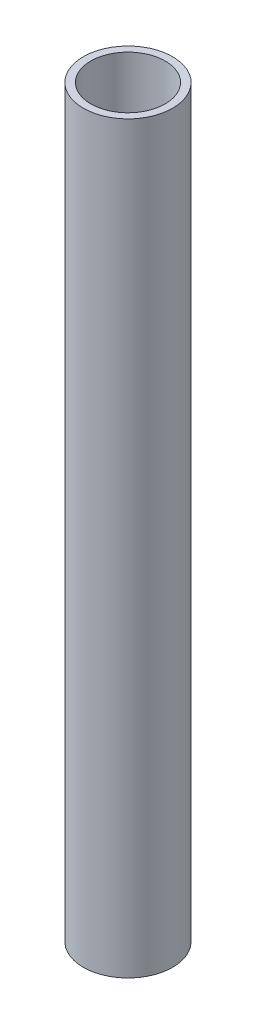
ISO-10303-21;
HEADER;
FILE_DESCRIPTION(('STEP AP214'),'2;1');
FILE_NAME('part.step','',(''),(''),'','','');
FILE_SCHEMA(('AUTOMOTIVE_DESIGN { 1 0 10303 214 1 1 1 1 }'));
ENDSEC;
DATA;
#1=APPLICATION_CONTEXT('core data for automotive mechanical design processes');
#2=APPLICATION_PROTOCOL_DEFINITION('international standard','automotive_design',2000,#1);
#3=PRODUCT_CONTEXT('',#1,'mechanical');
#4=PRODUCT('Part','Part','',(#3));
#5=PRODUCT_RELATED_PRODUCT_CATEGORY('part','',(#4));
#6=PRODUCT_DEFINITION_FORMATION('','',#4);
#7=PRODUCT_DEFINITION_CONTEXT('part definition',#1,'design');
#8=PRODUCT_DEFINITION('design','',#6,#7);
#9=PRODUCT_DEFINITION_SHAPE('','',#8);
#10=(LENGTH_UNIT() NAMED_UNIT(*) SI_UNIT(.MILLI.,.METRE.));
#11=(NAMED_UNIT(*) PLANE_ANGLE_UNIT() SI_UNIT($,.RADIAN.));
#12=(NAMED_UNIT(*) SI_UNIT($,.STERADIAN.) SOLID_ANGLE_UNIT());
#13=UNCERTAINTY_MEASURE_WITH_UNIT(LENGTH_MEASURE(1.E-05),#10,'distance_accuracy_value','');
#14=(GEOMETRIC_REPRESENTATION_CONTEXT(3) GLOBAL_UNCERTAINTY_ASSIGNED_CONTEXT((#13)) GLOBAL_UNIT_ASSIGNED_CONTEXT((#10,
#11,#12)) REPRESENTATION_CONTEXT('',''));
#15=CARTESIAN_POINT('',(0.,0.,0.));
#16=DIRECTION('',(0.,0.,1.));
#17=DIRECTION('',(1.,0.,0.));
#18=AXIS2_PLACEMENT_3D('',#15,#16,#17);
#19=CARTESIAN_POINT('',(0.,0.,0.));
#20=DIRECTION('',(0.,-1.,0.));
#21=DIRECTION('',(0.,0.,-1.));
#22=AXIS2_PLACEMENT_3D('',#19,#20,#21);
#23=CYLINDRICAL_SURFACE('',#22,15.24);
#24=CARTESIAN_POINT('',(0.,-254.,0.));
#25=DIRECTION('',(0.,1.,0.));
#26=DIRECTION('',(0.,0.,1.));
#27=AXIS2_PLACEMENT_3D('',#24,#25,#26);
#28=CIRCLE('',#27,15.24);
#29=CARTESIAN_POINT('',(0.,-254.,15.24));
#30=VERTEX_POINT('',#29);
#31=EDGE_CURVE('E51',#30,#30,#28,.T.);
#32=ORIENTED_EDGE('',*,*,#31,.T.);
#33=EDGE_LOOP('',(#32));
#34=FACE_BOUND('',#33,.T.);
#35=CARTESIAN_POINT('',(0.,0.,0.));
#36=DIRECTION('',(0.,1.,0.));
#37=DIRECTION('',(0.,0.,1.));
#38=AXIS2_PLACEMENT_3D('',#35,#36,#37);
#39=CIRCLE('',#38,15.24);
#40=CARTESIAN_POINT('',(0.,0.,15.24));
#41=VERTEX_POINT('',#40);
#42=EDGE_CURVE('E40',#41,#41,#39,.T.);
#43=ORIENTED_EDGE('',*,*,#42,.F.);
#44=EDGE_LOOP('',(#43));
#45=FACE_BOUND('',#44,.T.);
#46=ADVANCED_FACE('F37',(#34,#45),#23,.T.);
#47=CARTESIAN_POINT('',(0.,0.,0.));
#48=DIRECTION('',(0.,1.,0.));
#49=DIRECTION('',(0.,0.,1.));
#50=AXIS2_PLACEMENT_3D('',#47,#48,#49);
#51=PLANE('',#50);
#52=CARTESIAN_POINT('',(0.,0.,0.));
#53=DIRECTION('',(0.,1.,0.));
#54=DIRECTION('',(0.,0.,1.));
#55=AXIS2_PLACEMENT_3D('',#52,#53,#54);
#56=CIRCLE('',#55,12.7);
#57=CARTESIAN_POINT('',(0.,0.,12.7));
#58=VERTEX_POINT('',#57);
#59=EDGE_CURVE('E45',#58,#58,#56,.F.);
#60=ORIENTED_EDGE('',*,*,#59,.T.);
#61=EDGE_LOOP('',(#60));
#62=FACE_BOUND('',#61,.T.);
#63=ORIENTED_EDGE('',*,*,#42,.T.);
#64=EDGE_LOOP('',(#63));
#65=FACE_BOUND('',#64,.T.);
#66=ADVANCED_FACE('F61',(#62,#65),#51,.T.);
#67=CARTESIAN_POINT('',(0.,-254.,0.));
#68=DIRECTION('',(0.,1.,0.));
#69=DIRECTION('',(0.,0.,1.));
#70=AXIS2_PLACEMENT_3D('',#67,#68,#69);
#71=PLANE('',#70);
#72=CARTESIAN_POINT('',(0.,-254.,0.));
#73=DIRECTION('',(0.,1.,0.));
#74=DIRECTION('',(0.,0.,1.));
#75=AXIS2_PLACEMENT_3D('',#72,#73,#74);
#76=CIRCLE('',#75,12.7);
#77=CARTESIAN_POINT('',(0.,-254.,12.7));
#78=VERTEX_POINT('',#77);
#79=EDGE_CURVE('E10',#78,#78,#76,.F.);
#80=ORIENTED_EDGE('',*,*,#79,.F.);
#81=EDGE_LOOP('',(#80));
#82=FACE_BOUND('',#81,.T.);
#83=ORIENTED_EDGE('',*,*,#31,.F.);
#84=EDGE_LOOP('',(#83));
#85=FACE_BOUND('',#84,.T.);
#86=ADVANCED_FACE('F67',(#82,#85),#71,.F.);
#87=CARTESIAN_POINT('',(0.,0.,0.));
#88=DIRECTION('',(0.,-1.,0.));
#89=DIRECTION('',(0.,0.,-1.));
#90=AXIS2_PLACEMENT_3D('',#87,#88,#89);
#91=CYLINDRICAL_SURFACE('',#90,12.7);
#92=ORIENTED_EDGE('',*,*,#79,.T.);
#93=EDGE_LOOP('',(#92));
#94=FACE_BOUND('',#93,.T.);
#95=ORIENTED_EDGE('',*,*,#59,.F.);
#96=EDGE_LOOP('',(#95));
#97=FACE_BOUND('',#96,.T.);
#98=ADVANCED_FACE('F69',(#94,#97),#91,.F.);
#99=CLOSED_SHELL('',(#46,#66,#86,#98));
#100=MANIFOLD_SOLID_BREP('B2',#99);
#101=ADVANCED_BREP_SHAPE_REPRESENTATION('',(#18,#100),#14);
#102=SHAPE_DEFINITION_REPRESENTATION(#9,#101);
ENDSEC;
END-ISO-10303-21;
